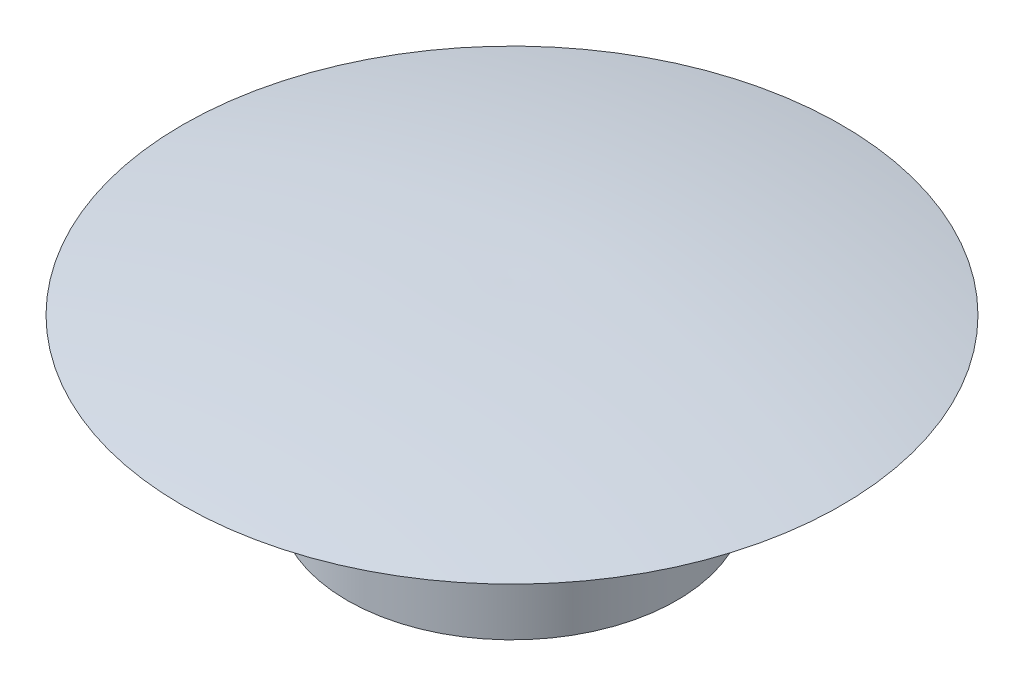
ISO-10303-21;
HEADER;
FILE_DESCRIPTION(('STEP AP214'),'2;1');
FILE_NAME('part.step','',(''),(''),'','','');
FILE_SCHEMA(('AUTOMOTIVE_DESIGN { 1 0 10303 214 1 1 1 1 }'));
ENDSEC;
DATA;
#1=APPLICATION_CONTEXT('core data for automotive mechanical design processes');
#2=APPLICATION_PROTOCOL_DEFINITION('international standard','automotive_design',2000,#1);
#3=PRODUCT_CONTEXT('',#1,'mechanical');
#4=PRODUCT('Part','Part','',(#3));
#5=PRODUCT_RELATED_PRODUCT_CATEGORY('part','',(#4));
#6=PRODUCT_DEFINITION_FORMATION('','',#4);
#7=PRODUCT_DEFINITION_CONTEXT('part definition',#1,'design');
#8=PRODUCT_DEFINITION('design','',#6,#7);
#9=PRODUCT_DEFINITION_SHAPE('','',#8);
#10=(LENGTH_UNIT() NAMED_UNIT(*) SI_UNIT(.MILLI.,.METRE.));
#11=(NAMED_UNIT(*) PLANE_ANGLE_UNIT() SI_UNIT($,.RADIAN.));
#12=(NAMED_UNIT(*) SI_UNIT($,.STERADIAN.) SOLID_ANGLE_UNIT());
#13=UNCERTAINTY_MEASURE_WITH_UNIT(LENGTH_MEASURE(1.E-05),#10,'distance_accuracy_value','');
#14=(GEOMETRIC_REPRESENTATION_CONTEXT(3) GLOBAL_UNCERTAINTY_ASSIGNED_CONTEXT((#13)) GLOBAL_UNIT_ASSIGNED_CONTEXT((#10,
#11,#12)) REPRESENTATION_CONTEXT('',''));
#15=CARTESIAN_POINT('',(0.,0.,0.));
#16=DIRECTION('',(0.,0.,1.));
#17=DIRECTION('',(1.,0.,0.));
#18=AXIS2_PLACEMENT_3D('',#15,#16,#17);
#19=CARTESIAN_POINT('',(0.,-0.199999999999999,0.));
#20=DIRECTION('',(0.,-1.,0.));
#21=DIRECTION('',(0.,0.,-1.));
#22=AXIS2_PLACEMENT_3D('',#19,#20,#21);
#23=PLANE('',#22);
#24=CARTESIAN_POINT('',(0.,-0.2,0.));
#25=DIRECTION('',(0.,1.,0.));
#26=DIRECTION('',(0.,0.,1.));
#27=AXIS2_PLACEMENT_3D('',#24,#25,#26);
#28=CIRCLE('',#27,0.199999999999999);
#29=CARTESIAN_POINT('',(0.,-0.2,0.199999999999999));
#30=VERTEX_POINT('',#29);
#31=EDGE_CURVE('E21',#30,#30,#28,.T.);
#32=ORIENTED_EDGE('',*,*,#31,.F.);
#33=EDGE_LOOP('',(#32));
#34=FACE_BOUND('',#33,.T.);
#35=ADVANCED_FACE('F17',(#34),#23,.T.);
#36=CARTESIAN_POINT('',(0.,-1.82297805659435,0.0245468276093879));
#37=DIRECTION('',(-1.,0.,0.));
#38=DIRECTION('',(0.,0.,1.));
#39=AXIS2_PLACEMENT_3D('',#36,#37,#38);
#40=CIRCLE('',#39,1.86123993065985);
#41=TRIMMED_CURVE('',#40,(PARAMETER_VALUE(-1.58398513649709)),
(PARAMETER_VALUE(1.58398513649709)),.T.,.PARAMETER.);
#42=CARTESIAN_POINT('',(0.,-1.82297805659435,0.));
#43=DIRECTION('',(0.,1.,0.));
#44=AXIS1_PLACEMENT('',#42,#43);
#45=SURFACE_OF_REVOLUTION('',#41,#44);
#46=CARTESIAN_POINT('',(0.,0.0380999999999999,0.));
#47=VERTEX_POINT('',#46);
#48=VERTEX_LOOP('',#47);
#49=FACE_BOUND('',#48,.T.);
#50=CARTESIAN_POINT('',(0.,0.,0.));
#51=DIRECTION('',(0.,1.,0.));
#52=DIRECTION('',(-1.,0.,0.));
#53=AXIS2_PLACEMENT_3D('',#50,#51,#52);
#54=CIRCLE('',#53,0.399999999999999);
#55=CARTESIAN_POINT('',(-0.399999999999998,0.,0.));
#56=VERTEX_POINT('',#55);
#57=EDGE_CURVE('E25',#56,#56,#54,.F.);
#58=ORIENTED_EDGE('',*,*,#57,.F.);
#59=EDGE_LOOP('',(#58));
#60=FACE_BOUND('',#59,.T.);
#61=ADVANCED_FACE('F19',(#49,#60),#45,.T.);
#62=CARTESIAN_POINT('',(0.,0.806016613409354,0.));
#63=DIRECTION('',(0.,1.,0.));
#64=DIRECTION('',(0.,0.,1.));
#65=AXIS2_PLACEMENT_3D('',#62,#63,#64);
#66=CYLINDRICAL_SURFACE('',#65,0.199999999999999);
#67=ORIENTED_EDGE('',*,*,#31,.T.);
#68=EDGE_LOOP('',(#67));
#69=FACE_BOUND('',#68,.T.);
#70=CARTESIAN_POINT('',(0.,0.,0.));
#71=DIRECTION('',(0.,1.,0.));
#72=DIRECTION('',(0.,0.,1.));
#73=AXIS2_PLACEMENT_3D('',#70,#71,#72);
#74=CIRCLE('',#73,0.199999999999999);
#75=CARTESIAN_POINT('',(0.,0.,0.199999999999999));
#76=VERTEX_POINT('',#75);
#77=EDGE_CURVE('E11',#76,#76,#74,.T.);
#78=ORIENTED_EDGE('',*,*,#77,.F.);
#79=EDGE_LOOP('',(#78));
#80=FACE_BOUND('',#79,.T.);
#81=ADVANCED_FACE('F31',(#69,#80),#66,.T.);
#82=CARTESIAN_POINT('',(0.,0.,0.199999999999999));
#83=DIRECTION('',(0.,-1.,0.));
#84=DIRECTION('',(0.,0.,-1.));
#85=AXIS2_PLACEMENT_3D('',#82,#83,#84);
#86=PLANE('',#85);
#87=ORIENTED_EDGE('',*,*,#77,.T.);
#88=EDGE_LOOP('',(#87));
#89=FACE_BOUND('',#88,.T.);
#90=ORIENTED_EDGE('',*,*,#57,.T.);
#91=EDGE_LOOP('',(#90));
#92=FACE_BOUND('',#91,.T.);
#93=ADVANCED_FACE('F45',(#89,#92),#86,.T.);
#94=CLOSED_SHELL('',(#35,#61,#81,#93));
#95=MANIFOLD_SOLID_BREP('B1',#94);
#96=ADVANCED_BREP_SHAPE_REPRESENTATION('',(#18,#95),#14);
#97=SHAPE_DEFINITION_REPRESENTATION(#9,#96);
ENDSEC;
END-ISO-10303-21;
